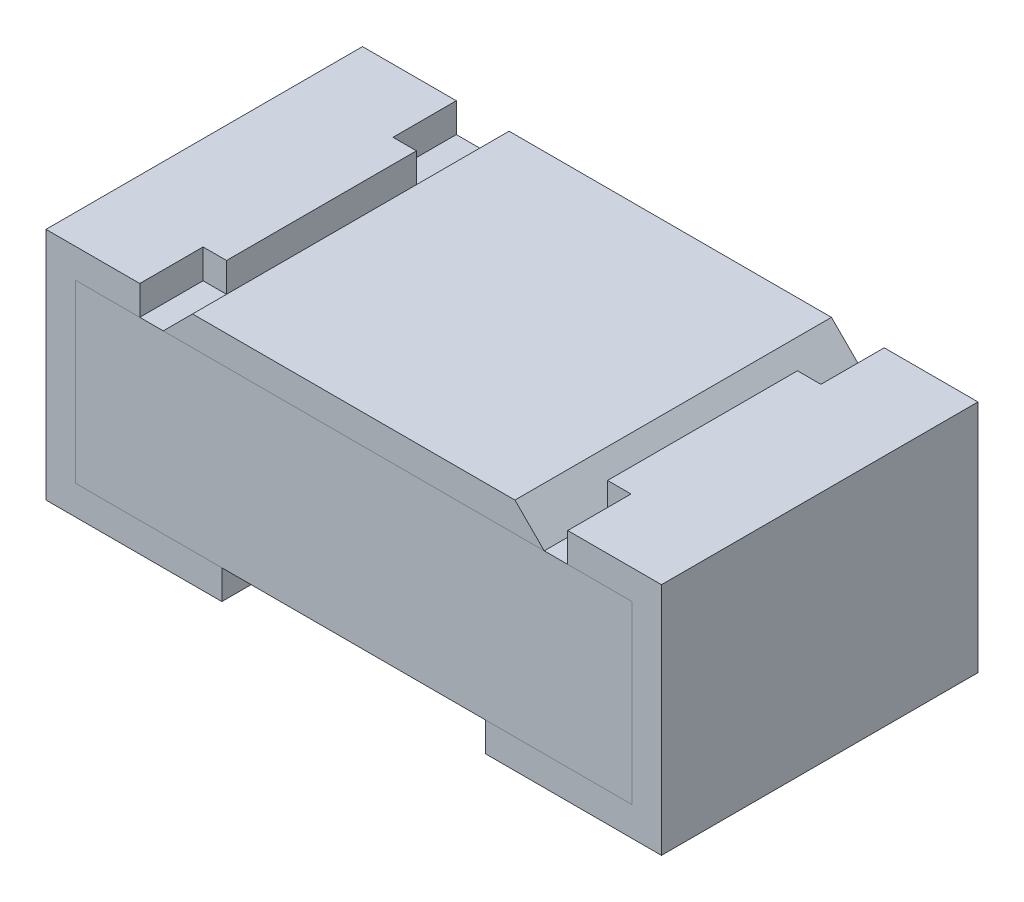
ISO-10303-21;
HEADER;
FILE_DESCRIPTION(('STEP AP214'),'2;1');
FILE_NAME('part.step','',(''),(''),'','','');
FILE_SCHEMA(('AUTOMOTIVE_DESIGN { 1 0 10303 214 1 1 1 1 }'));
ENDSEC;
DATA;
#1=APPLICATION_CONTEXT('core data for automotive mechanical design processes');
#2=APPLICATION_PROTOCOL_DEFINITION('international standard','automotive_design',2000,#1);
#3=PRODUCT_CONTEXT('',#1,'mechanical');
#4=PRODUCT('Part','Part','',(#3));
#5=PRODUCT_RELATED_PRODUCT_CATEGORY('part','',(#4));
#6=PRODUCT_DEFINITION_FORMATION('','',#4);
#7=PRODUCT_DEFINITION_CONTEXT('part definition',#1,'design');
#8=PRODUCT_DEFINITION('design','',#6,#7);
#9=PRODUCT_DEFINITION_SHAPE('','',#8);
#10=(LENGTH_UNIT() NAMED_UNIT(*) SI_UNIT(.MILLI.,.METRE.));
#11=(NAMED_UNIT(*) PLANE_ANGLE_UNIT() SI_UNIT($,.RADIAN.));
#12=(NAMED_UNIT(*) SI_UNIT($,.STERADIAN.) SOLID_ANGLE_UNIT());
#13=UNCERTAINTY_MEASURE_WITH_UNIT(LENGTH_MEASURE(1.E-05),#10,'distance_accuracy_value','');
#14=(GEOMETRIC_REPRESENTATION_CONTEXT(3) GLOBAL_UNCERTAINTY_ASSIGNED_CONTEXT((#13)) GLOBAL_UNIT_ASSIGNED_CONTEXT((#10,
#11,#12)) REPRESENTATION_CONTEXT('',''));
#15=CARTESIAN_POINT('',(0.,0.,0.));
#16=DIRECTION('',(0.,0.,1.));
#17=DIRECTION('',(1.,0.,0.));
#18=AXIS2_PLACEMENT_3D('',#15,#16,#17);
#19=CARTESIAN_POINT('',(0.225,0.,-0.77));
#20=DIRECTION('',(-1.,0.,0.));
#21=DIRECTION('',(0.,0.,1.));
#22=AXIS2_PLACEMENT_3D('',#19,#20,#21);
#23=PLANE('',#22);
#24=DIRECTION('',(0.,1.,0.));
#25=VECTOR('',#24,1.);
#26=CARTESIAN_POINT('',(0.225,0.,-0.27));
#27=LINE('',#26,#25);
#28=CARTESIAN_POINT('',(0.225,0.,-0.27));
#29=VERTEX_POINT('',#28);
#30=CARTESIAN_POINT('',(0.225,0.0500000000000001,-0.27));
#31=VERTEX_POINT('',#30);
#32=EDGE_CURVE('E60',#29,#31,#27,.T.);
#33=ORIENTED_EDGE('',*,*,#32,.F.);
#34=DIRECTION('',(0.,0.,1.));
#35=VECTOR('',#34,1.);
#36=CARTESIAN_POINT('',(0.225,0.,-0.77));
#37=LINE('',#36,#35);
#38=CARTESIAN_POINT('',(0.225,0.,0.27));
#39=VERTEX_POINT('',#38);
#40=EDGE_CURVE('E244',#29,#39,#37,.T.);
#41=ORIENTED_EDGE('',*,*,#40,.T.);
#42=DIRECTION('',(0.,-1.,0.));
#43=VECTOR('',#42,1.);
#44=CARTESIAN_POINT('',(0.225,0.,0.27));
#45=LINE('',#44,#43);
#46=CARTESIAN_POINT('',(0.225,0.0500000000000001,0.27));
#47=VERTEX_POINT('',#46);
#48=EDGE_CURVE('E174',#47,#39,#45,.T.);
#49=ORIENTED_EDGE('',*,*,#48,.F.);
#50=DIRECTION('',(0.,0.,1.));
#51=VECTOR('',#50,1.);
#52=CARTESIAN_POINT('',(0.225,0.0500000000000001,-0.77));
#53=LINE('',#52,#51);
#54=EDGE_CURVE('E204',#31,#47,#53,.T.);
#55=ORIENTED_EDGE('',*,*,#54,.F.);
#56=EDGE_LOOP('',(#33,#41,#49,#55));
#57=FACE_BOUND('',#56,.T.);
#58=ADVANCED_FACE('F52',(#57),#23,.T.);
#59=CARTESIAN_POINT('',(0.225,0.0500000000000001,-0.77));
#60=DIRECTION('',(0.,1.,0.));
#61=DIRECTION('',(-1.,0.,0.));
#62=AXIS2_PLACEMENT_3D('',#59,#60,#61);
#63=PLANE('',#62);
#64=DIRECTION('',(1.,0.,0.));
#65=VECTOR('',#64,1.);
#66=CARTESIAN_POINT('',(0.225,0.0500000000000001,-0.27));
#67=LINE('',#66,#65);
#68=CARTESIAN_POINT('',(0.475,0.0500000000000001,-0.27));
#69=VERTEX_POINT('',#68);
#70=EDGE_CURVE('E213',#31,#69,#67,.T.);
#71=ORIENTED_EDGE('',*,*,#70,.F.);
#72=ORIENTED_EDGE('',*,*,#54,.T.);
#73=DIRECTION('',(-1.,0.,0.));
#74=VECTOR('',#73,1.);
#75=CARTESIAN_POINT('',(0.225,0.0500000000000001,0.27));
#76=LINE('',#75,#74);
#77=CARTESIAN_POINT('',(0.475,0.0500000000000001,0.27));
#78=VERTEX_POINT('',#77);
#79=EDGE_CURVE('E240',#78,#47,#76,.T.);
#80=ORIENTED_EDGE('',*,*,#79,.F.);
#81=DIRECTION('',(0.,0.,1.));
#82=VECTOR('',#81,1.);
#83=CARTESIAN_POINT('',(0.475,0.0500000000000001,-0.77));
#84=LINE('',#83,#82);
#85=EDGE_CURVE('E247',#69,#78,#84,.T.);
#86=ORIENTED_EDGE('',*,*,#85,.F.);
#87=EDGE_LOOP('',(#71,#72,#80,#86));
#88=FACE_BOUND('',#87,.T.);
#89=ADVANCED_FACE('F283',(#88),#63,.T.);
#90=CARTESIAN_POINT('',(0.475,0.0500000000000001,-0.77));
#91=DIRECTION('',(-1.,0.,0.));
#92=DIRECTION('',(0.,-1.,0.));
#93=AXIS2_PLACEMENT_3D('',#90,#91,#92);
#94=PLANE('',#93);
#95=DIRECTION('',(0.,1.,0.));
#96=VECTOR('',#95,1.);
#97=CARTESIAN_POINT('',(0.475,0.0500000000000001,-0.27));
#98=LINE('',#97,#96);
#99=CARTESIAN_POINT('',(0.475,0.35,-0.27));
#100=VERTEX_POINT('',#99);
#101=EDGE_CURVE('E210',#69,#100,#98,.T.);
#102=ORIENTED_EDGE('',*,*,#101,.F.);
#103=ORIENTED_EDGE('',*,*,#85,.T.);
#104=DIRECTION('',(0.,-1.,0.));
#105=VECTOR('',#104,1.);
#106=CARTESIAN_POINT('',(0.475,0.0500000000000001,0.27));
#107=LINE('',#106,#105);
#108=CARTESIAN_POINT('',(0.475,0.35,0.27));
#109=VERTEX_POINT('',#108);
#110=EDGE_CURVE('E236',#109,#78,#107,.T.);
#111=ORIENTED_EDGE('',*,*,#110,.F.);
#112=DIRECTION('',(0.,0.,1.));
#113=VECTOR('',#112,1.);
#114=CARTESIAN_POINT('',(0.475,0.35,-0.77));
#115=LINE('',#114,#113);
#116=EDGE_CURVE('E250',#100,#109,#115,.T.);
#117=ORIENTED_EDGE('',*,*,#116,.F.);
#118=EDGE_LOOP('',(#102,#103,#111,#117));
#119=FACE_BOUND('',#118,.T.);
#120=ADVANCED_FACE('F289',(#119),#94,.T.);
#121=CARTESIAN_POINT('',(0.475,0.35,-0.77));
#122=DIRECTION('',(0.,-1.,0.));
#123=DIRECTION('',(1.,0.,0.));
#124=AXIS2_PLACEMENT_3D('',#121,#122,#123);
#125=PLANE('',#124);
#126=DIRECTION('',(0.,0.,-1.));
#127=VECTOR('',#126,1.);
#128=CARTESIAN_POINT('',(0.365,0.35,-0.27));
#129=LINE('',#128,#127);
#130=CARTESIAN_POINT('',(0.365,0.35,-0.162));
#131=VERTEX_POINT('',#130);
#132=CARTESIAN_POINT('',(0.365,0.35,-0.27));
#133=VERTEX_POINT('',#132);
#134=EDGE_CURVE('E139',#131,#133,#129,.T.);
#135=ORIENTED_EDGE('',*,*,#134,.T.);
#136=DIRECTION('',(-1.,0.,0.));
#137=VECTOR('',#136,1.);
#138=CARTESIAN_POINT('',(0.475,0.35,-0.27));
#139=LINE('',#138,#137);
#140=EDGE_CURVE('E207',#100,#133,#139,.T.);
#141=ORIENTED_EDGE('',*,*,#140,.F.);
#142=ORIENTED_EDGE('',*,*,#116,.T.);
#143=DIRECTION('',(1.,0.,0.));
#144=VECTOR('',#143,1.);
#145=CARTESIAN_POINT('',(0.475,0.35,0.27));
#146=LINE('',#145,#144);
#147=CARTESIAN_POINT('',(0.365,0.35,0.27));
#148=VERTEX_POINT('',#147);
#149=EDGE_CURVE('E233',#148,#109,#146,.T.);
#150=ORIENTED_EDGE('',*,*,#149,.F.);
#151=DIRECTION('',(0.,0.,-1.));
#152=VECTOR('',#151,1.);
#153=CARTESIAN_POINT('',(0.365,0.35,0.27));
#154=LINE('',#153,#152);
#155=CARTESIAN_POINT('',(0.365,0.35,0.162));
#156=VERTEX_POINT('',#155);
#157=EDGE_CURVE('E67',#148,#156,#154,.T.);
#158=ORIENTED_EDGE('',*,*,#157,.T.);
#159=DIRECTION('',(-1.,0.,0.));
#160=VECTOR('',#159,1.);
#161=CARTESIAN_POINT('',(0.325,0.35,0.162));
#162=LINE('',#161,#160);
#163=CARTESIAN_POINT('',(0.325,0.35,0.162));
#164=VERTEX_POINT('',#163);
#165=EDGE_CURVE('E189',#156,#164,#162,.T.);
#166=ORIENTED_EDGE('',*,*,#165,.T.);
#167=DIRECTION('',(0.,0.,1.));
#168=VECTOR('',#167,1.);
#169=CARTESIAN_POINT('',(0.325,0.35,-0.77));
#170=LINE('',#169,#168);
#171=CARTESIAN_POINT('',(0.325,0.35,-0.162));
#172=VERTEX_POINT('',#171);
#173=EDGE_CURVE('E164',#172,#164,#170,.T.);
#174=ORIENTED_EDGE('',*,*,#173,.F.);
#175=DIRECTION('',(1.,0.,0.));
#176=VECTOR('',#175,1.);
#177=CARTESIAN_POINT('',(0.325,0.35,-0.162));
#178=LINE('',#177,#176);
#179=EDGE_CURVE('E154',#172,#131,#178,.T.);
#180=ORIENTED_EDGE('',*,*,#179,.T.);
#181=EDGE_LOOP('',(#135,#141,#142,#150,#158,#166,#174,#180));
#182=FACE_BOUND('',#181,.T.);
#183=ADVANCED_FACE('F161',(#182),#125,.T.);
#184=CARTESIAN_POINT('',(0.325,0.4,-0.77));
#185=DIRECTION('',(-1.,0.,0.));
#186=DIRECTION('',(0.,-1.,0.));
#187=AXIS2_PLACEMENT_3D('',#184,#185,#186);
#188=PLANE('',#187);
#189=DIRECTION('',(0.,1.,0.));
#190=VECTOR('',#189,1.);
#191=CARTESIAN_POINT('',(0.325,-0.00100000000000002,-0.162));
#192=LINE('',#191,#190);
#193=CARTESIAN_POINT('',(0.325,0.4,-0.162));
#194=VERTEX_POINT('',#193);
#195=EDGE_CURVE('E150',#172,#194,#192,.T.);
#196=ORIENTED_EDGE('',*,*,#195,.F.);
#197=ORIENTED_EDGE('',*,*,#173,.T.);
#198=DIRECTION('',(0.,1.,0.));
#199=VECTOR('',#198,1.);
#200=CARTESIAN_POINT('',(0.325,-0.00100000000000002,0.162));
#201=LINE('',#200,#199);
#202=CARTESIAN_POINT('',(0.325,0.4,0.162));
#203=VERTEX_POINT('',#202);
#204=EDGE_CURVE('E182',#164,#203,#201,.T.);
#205=ORIENTED_EDGE('',*,*,#204,.T.);
#206=DIRECTION('',(0.,0.,1.));
#207=VECTOR('',#206,1.);
#208=CARTESIAN_POINT('',(0.325,0.4,-0.77));
#209=LINE('',#208,#207);
#210=EDGE_CURVE('E255',#194,#203,#209,.T.);
#211=ORIENTED_EDGE('',*,*,#210,.F.);
#212=EDGE_LOOP('',(#196,#197,#205,#211));
#213=FACE_BOUND('',#212,.T.);
#214=ADVANCED_FACE('F306',(#213),#188,.T.);
#215=CARTESIAN_POINT('',(0.525,0.4,-0.77));
#216=DIRECTION('',(0.,1.,0.));
#217=DIRECTION('',(-1.,0.,0.));
#218=AXIS2_PLACEMENT_3D('',#215,#216,#217);
#219=PLANE('',#218);
#220=DIRECTION('',(0.,0.,-1.));
#221=VECTOR('',#220,1.);
#222=CARTESIAN_POINT('',(0.365,0.4,-0.27));
#223=LINE('',#222,#221);
#224=CARTESIAN_POINT('',(0.365,0.4,-0.162));
#225=VERTEX_POINT('',#224);
#226=CARTESIAN_POINT('',(0.365,0.4,-0.27));
#227=VERTEX_POINT('',#226);
#228=EDGE_CURVE('E75',#225,#227,#223,.T.);
#229=ORIENTED_EDGE('',*,*,#228,.F.);
#230=DIRECTION('',(1.,0.,0.));
#231=VECTOR('',#230,1.);
#232=CARTESIAN_POINT('',(0.325,0.4,-0.162));
#233=LINE('',#232,#231);
#234=EDGE_CURVE('E157',#194,#225,#233,.T.);
#235=ORIENTED_EDGE('',*,*,#234,.F.);
#236=ORIENTED_EDGE('',*,*,#210,.T.);
#237=DIRECTION('',(-1.,0.,0.));
#238=VECTOR('',#237,1.);
#239=CARTESIAN_POINT('',(0.325,0.4,0.162));
#240=LINE('',#239,#238);
#241=CARTESIAN_POINT('',(0.365,0.4,0.162));
#242=VERTEX_POINT('',#241);
#243=EDGE_CURVE('E178',#242,#203,#240,.T.);
#244=ORIENTED_EDGE('',*,*,#243,.F.);
#245=DIRECTION('',(0.,0.,-1.));
#246=VECTOR('',#245,1.);
#247=CARTESIAN_POINT('',(0.365,0.4,0.27));
#248=LINE('',#247,#246);
#249=CARTESIAN_POINT('',(0.365,0.4,0.27));
#250=VERTEX_POINT('',#249);
#251=EDGE_CURVE('E185',#250,#242,#248,.T.);
#252=ORIENTED_EDGE('',*,*,#251,.F.);
#253=DIRECTION('',(-1.,0.,0.));
#254=VECTOR('',#253,1.);
#255=CARTESIAN_POINT('',(0.525,0.4,0.27));
#256=LINE('',#255,#254);
#257=CARTESIAN_POINT('',(0.525,0.4,0.27));
#258=VERTEX_POINT('',#257);
#259=EDGE_CURVE('E229',#258,#250,#256,.T.);
#260=ORIENTED_EDGE('',*,*,#259,.F.);
#261=DIRECTION('',(0.,0.,1.));
#262=VECTOR('',#261,1.);
#263=CARTESIAN_POINT('',(0.525,0.4,-0.77));
#264=LINE('',#263,#262);
#265=CARTESIAN_POINT('',(0.525,0.4,-0.27));
#266=VERTEX_POINT('',#265);
#267=EDGE_CURVE('E259',#266,#258,#264,.T.);
#268=ORIENTED_EDGE('',*,*,#267,.F.);
#269=DIRECTION('',(1.,0.,0.));
#270=VECTOR('',#269,1.);
#271=CARTESIAN_POINT('',(0.525,0.4,-0.27));
#272=LINE('',#271,#270);
#273=EDGE_CURVE('E203',#227,#266,#272,.T.);
#274=ORIENTED_EDGE('',*,*,#273,.F.);
#275=EDGE_LOOP('',(#229,#235,#236,#244,#252,#260,#268,#274));
#276=FACE_BOUND('',#275,.T.);
#277=ADVANCED_FACE('F295',(#276),#219,.T.);
#278=CARTESIAN_POINT('',(0.525,0.,-0.77));
#279=DIRECTION('',(1.,0.,0.));
#280=DIRECTION('',(0.,0.,-1.));
#281=AXIS2_PLACEMENT_3D('',#278,#279,#280);
#282=PLANE('',#281);
#283=DIRECTION('',(0.,-1.,0.));
#284=VECTOR('',#283,1.);
#285=CARTESIAN_POINT('',(0.525,0.,-0.27));
#286=LINE('',#285,#284);
#287=CARTESIAN_POINT('',(0.525,0.,-0.27));
#288=VERTEX_POINT('',#287);
#289=EDGE_CURVE('E200',#266,#288,#286,.T.);
#290=ORIENTED_EDGE('',*,*,#289,.F.);
#291=ORIENTED_EDGE('',*,*,#267,.T.);
#292=DIRECTION('',(0.,1.,0.));
#293=VECTOR('',#292,1.);
#294=CARTESIAN_POINT('',(0.525,0.,0.27));
#295=LINE('',#294,#293);
#296=CARTESIAN_POINT('',(0.525,0.,0.27));
#297=VERTEX_POINT('',#296);
#298=EDGE_CURVE('E225',#297,#258,#295,.T.);
#299=ORIENTED_EDGE('',*,*,#298,.F.);
#300=DIRECTION('',(0.,0.,1.));
#301=VECTOR('',#300,1.);
#302=CARTESIAN_POINT('',(0.525,0.,-0.77));
#303=LINE('',#302,#301);
#304=EDGE_CURVE('E262',#288,#297,#303,.T.);
#305=ORIENTED_EDGE('',*,*,#304,.F.);
#306=EDGE_LOOP('',(#290,#291,#299,#305));
#307=FACE_BOUND('',#306,.T.);
#308=ADVANCED_FACE('F299',(#307),#282,.T.);
#309=CARTESIAN_POINT('',(0.525,0.,-0.77));
#310=DIRECTION('',(0.,-1.,0.));
#311=DIRECTION('',(1.,0.,0.));
#312=AXIS2_PLACEMENT_3D('',#309,#310,#311);
#313=PLANE('',#312);
#314=DIRECTION('',(-1.,0.,0.));
#315=VECTOR('',#314,1.);
#316=CARTESIAN_POINT('',(0.525,0.,-0.27));
#317=LINE('',#316,#315);
#318=EDGE_CURVE('E12',#288,#29,#317,.T.);
#319=ORIENTED_EDGE('',*,*,#318,.F.);
#320=ORIENTED_EDGE('',*,*,#304,.T.);
#321=DIRECTION('',(1.,0.,0.));
#322=VECTOR('',#321,1.);
#323=CARTESIAN_POINT('',(0.525,0.,0.27));
#324=LINE('',#323,#322);
#325=EDGE_CURVE('E221',#39,#297,#324,.T.);
#326=ORIENTED_EDGE('',*,*,#325,.F.);
#327=ORIENTED_EDGE('',*,*,#40,.F.);
#328=EDGE_LOOP('',(#319,#320,#326,#327));
#329=FACE_BOUND('',#328,.T.);
#330=ADVANCED_FACE('F273',(#329),#313,.T.);
#331=CARTESIAN_POINT('',(0.,0.,0.27));
#332=DIRECTION('',(0.,0.,-1.));
#333=DIRECTION('',(-1.,0.,0.));
#334=AXIS2_PLACEMENT_3D('',#331,#332,#333);
#335=PLANE('',#334);
#336=ORIENTED_EDGE('',*,*,#259,.T.);
#337=DIRECTION('',(0.,1.,0.));
#338=VECTOR('',#337,1.);
#339=CARTESIAN_POINT('',(0.365,-0.00100000000000002,0.27));
#340=LINE('',#339,#338);
#341=EDGE_CURVE('E192',#148,#250,#340,.T.);
#342=ORIENTED_EDGE('',*,*,#341,.F.);
#343=ORIENTED_EDGE('',*,*,#149,.T.);
#344=ORIENTED_EDGE('',*,*,#110,.T.);
#345=ORIENTED_EDGE('',*,*,#79,.T.);
#346=ORIENTED_EDGE('',*,*,#48,.T.);
#347=ORIENTED_EDGE('',*,*,#325,.T.);
#348=ORIENTED_EDGE('',*,*,#298,.T.);
#349=EDGE_LOOP('',(#336,#342,#343,#344,#345,#346,#347,#348));
#350=FACE_BOUND('',#349,.T.);
#351=ADVANCED_FACE('F277',(#350),#335,.F.);
#352=CARTESIAN_POINT('',(-0.475,0.35,-0.27));
#353=DIRECTION('',(0.,0.,1.));
#354=DIRECTION('',(1.,0.,0.));
#355=AXIS2_PLACEMENT_3D('',#352,#353,#354);
#356=PLANE('',#355);
#357=ORIENTED_EDGE('',*,*,#140,.T.);
#358=DIRECTION('',(0.,1.,0.));
#359=VECTOR('',#358,1.);
#360=CARTESIAN_POINT('',(0.365,-0.00100000000000002,-0.27));
#361=LINE('',#360,#359);
#362=EDGE_CURVE('E144',#133,#227,#361,.T.);
#363=ORIENTED_EDGE('',*,*,#362,.T.);
#364=ORIENTED_EDGE('',*,*,#273,.T.);
#365=ORIENTED_EDGE('',*,*,#289,.T.);
#366=ORIENTED_EDGE('',*,*,#318,.T.);
#367=ORIENTED_EDGE('',*,*,#32,.T.);
#368=ORIENTED_EDGE('',*,*,#70,.T.);
#369=ORIENTED_EDGE('',*,*,#101,.T.);
#370=EDGE_LOOP('',(#357,#363,#364,#365,#366,#367,#368,#369));
#371=FACE_BOUND('',#370,.T.);
#372=ADVANCED_FACE('F286',(#371),#356,.F.);
#373=CARTESIAN_POINT('',(0.365,-0.00100000000000002,-0.27));
#374=DIRECTION('',(1.,0.,0.));
#375=DIRECTION('',(0.,0.,-1.));
#376=AXIS2_PLACEMENT_3D('',#373,#374,#375);
#377=PLANE('',#376);
#378=DIRECTION('',(0.,1.,0.));
#379=VECTOR('',#378,1.);
#380=CARTESIAN_POINT('',(0.365,-0.00100000000000002,-0.162));
#381=LINE('',#380,#379);
#382=EDGE_CURVE('E142',#131,#225,#381,.T.);
#383=ORIENTED_EDGE('',*,*,#382,.T.);
#384=ORIENTED_EDGE('',*,*,#228,.T.);
#385=ORIENTED_EDGE('',*,*,#362,.F.);
#386=ORIENTED_EDGE('',*,*,#134,.F.);
#387=EDGE_LOOP('',(#383,#384,#385,#386));
#388=FACE_BOUND('',#387,.T.);
#389=ADVANCED_FACE('F141',(#388),#377,.F.);
#390=CARTESIAN_POINT('',(0.325,-0.00100000000000002,-0.162));
#391=DIRECTION('',(0.,0.,1.));
#392=DIRECTION('',(1.,0.,0.));
#393=AXIS2_PLACEMENT_3D('',#390,#391,#392);
#394=PLANE('',#393);
#395=ORIENTED_EDGE('',*,*,#195,.T.);
#396=ORIENTED_EDGE('',*,*,#234,.T.);
#397=ORIENTED_EDGE('',*,*,#382,.F.);
#398=ORIENTED_EDGE('',*,*,#179,.F.);
#399=EDGE_LOOP('',(#395,#396,#397,#398));
#400=FACE_BOUND('',#399,.T.);
#401=ADVANCED_FACE('F153',(#400),#394,.F.);
#402=CARTESIAN_POINT('',(0.325,-0.00100000000000002,0.162));
#403=DIRECTION('',(0.,0.,-1.));
#404=DIRECTION('',(-1.,0.,0.));
#405=AXIS2_PLACEMENT_3D('',#402,#403,#404);
#406=PLANE('',#405);
#407=DIRECTION('',(0.,1.,0.));
#408=VECTOR('',#407,1.);
#409=CARTESIAN_POINT('',(0.365,-0.00100000000000002,0.162));
#410=LINE('',#409,#408);
#411=EDGE_CURVE('E181',#156,#242,#410,.T.);
#412=ORIENTED_EDGE('',*,*,#411,.T.);
#413=ORIENTED_EDGE('',*,*,#243,.T.);
#414=ORIENTED_EDGE('',*,*,#204,.F.);
#415=ORIENTED_EDGE('',*,*,#165,.F.);
#416=EDGE_LOOP('',(#412,#413,#414,#415));
#417=FACE_BOUND('',#416,.T.);
#418=ADVANCED_FACE('F304',(#417),#406,.F.);
#419=CARTESIAN_POINT('',(0.365,-0.00100000000000002,0.27));
#420=DIRECTION('',(1.,0.,0.));
#421=DIRECTION('',(0.,0.,-1.));
#422=AXIS2_PLACEMENT_3D('',#419,#420,#421);
#423=PLANE('',#422);
#424=ORIENTED_EDGE('',*,*,#341,.T.);
#425=ORIENTED_EDGE('',*,*,#251,.T.);
#426=ORIENTED_EDGE('',*,*,#411,.F.);
#427=ORIENTED_EDGE('',*,*,#157,.F.);
#428=EDGE_LOOP('',(#424,#425,#426,#427));
#429=FACE_BOUND('',#428,.T.);
#430=ADVANCED_FACE('F300',(#429),#423,.F.);
#431=CLOSED_SHELL('',(#58,#89,#120,#183,#214,#277,#308,#330,#351,#372,#389,#401,#418,#430));
#432=MANIFOLD_SOLID_BREP('B2',#431);
#433=CARTESIAN_POINT('',(-0.475,0.05,-0.77));
#434=DIRECTION('',(1.,0.,0.));
#435=DIRECTION('',(0.,0.,-1.));
#436=AXIS2_PLACEMENT_3D('',#433,#434,#435);
#437=PLANE('',#436);
#438=DIRECTION('',(0.,-1.,0.));
#439=VECTOR('',#438,1.);
#440=CARTESIAN_POINT('',(-0.475,0.05,-0.27));
#441=LINE('',#440,#439);
#442=CARTESIAN_POINT('',(-0.475,0.35,-0.27));
#443=VERTEX_POINT('',#442);
#444=CARTESIAN_POINT('',(-0.475,0.05,-0.27));
#445=VERTEX_POINT('',#444);
#446=EDGE_CURVE('E452',#443,#445,#441,.T.);
#447=ORIENTED_EDGE('',*,*,#446,.F.);
#448=DIRECTION('',(0.,0.,1.));
#449=VECTOR('',#448,1.);
#450=CARTESIAN_POINT('',(-0.475,0.35,-0.77));
#451=LINE('',#450,#449);
#452=CARTESIAN_POINT('',(-0.475,0.35,0.27));
#453=VERTEX_POINT('',#452);
#454=EDGE_CURVE('E560',#443,#453,#451,.T.);
#455=ORIENTED_EDGE('',*,*,#454,.T.);
#456=DIRECTION('',(0.,1.,0.));
#457=VECTOR('',#456,1.);
#458=CARTESIAN_POINT('',(-0.475,0.05,0.27));
#459=LINE('',#458,#457);
#460=CARTESIAN_POINT('',(-0.475,0.05,0.27));
#461=VERTEX_POINT('',#460);
#462=EDGE_CURVE('E543',#461,#453,#459,.T.);
#463=ORIENTED_EDGE('',*,*,#462,.F.);
#464=DIRECTION('',(0.,0.,1.));
#465=VECTOR('',#464,1.);
#466=CARTESIAN_POINT('',(-0.475,0.05,-0.77));
#467=LINE('',#466,#465);
#468=EDGE_CURVE('E582',#445,#461,#467,.T.);
#469=ORIENTED_EDGE('',*,*,#468,.F.);
#470=EDGE_LOOP('',(#447,#455,#463,#469));
#471=FACE_BOUND('',#470,.T.);
#472=ADVANCED_FACE('F444',(#471),#437,.T.);
#473=CARTESIAN_POINT('',(-0.225,0.05,-0.77));
#474=DIRECTION('',(0.,1.,0.));
#475=DIRECTION('',(-1.,0.,0.));
#476=AXIS2_PLACEMENT_3D('',#473,#474,#475);
#477=PLANE('',#476);
#478=DIRECTION('',(1.,0.,0.));
#479=VECTOR('',#478,1.);
#480=CARTESIAN_POINT('',(-0.225,0.05,-0.27));
#481=LINE('',#480,#479);
#482=CARTESIAN_POINT('',(-0.225,0.05,-0.27));
#483=VERTEX_POINT('',#482);
#484=EDGE_CURVE('E613',#445,#483,#481,.T.);
#485=ORIENTED_EDGE('',*,*,#484,.F.);
#486=ORIENTED_EDGE('',*,*,#468,.T.);
#487=DIRECTION('',(-1.,0.,0.));
#488=VECTOR('',#487,1.);
#489=CARTESIAN_POINT('',(-0.225,0.05,0.27));
#490=LINE('',#489,#488);
#491=CARTESIAN_POINT('',(-0.225,0.05,0.27));
#492=VERTEX_POINT('',#491);
#493=EDGE_CURVE('E568',#492,#461,#490,.T.);
#494=ORIENTED_EDGE('',*,*,#493,.F.);
#495=DIRECTION('',(0.,0.,1.));
#496=VECTOR('',#495,1.);
#497=CARTESIAN_POINT('',(-0.225,0.05,-0.77));
#498=LINE('',#497,#496);
#499=EDGE_CURVE('E579',#483,#492,#498,.T.);
#500=ORIENTED_EDGE('',*,*,#499,.F.);
#501=EDGE_LOOP('',(#485,#486,#494,#500));
#502=FACE_BOUND('',#501,.T.);
#503=ADVANCED_FACE('F697',(#502),#477,.T.);
#504=CARTESIAN_POINT('',(-0.225,0.,-0.77));
#505=DIRECTION('',(1.,0.,0.));
#506=DIRECTION('',(0.,0.,-1.));
#507=AXIS2_PLACEMENT_3D('',#504,#505,#506);
#508=PLANE('',#507);
#509=DIRECTION('',(0.,-1.,0.));
#510=VECTOR('',#509,1.);
#511=CARTESIAN_POINT('',(-0.225,0.,-0.27));
#512=LINE('',#511,#510);
#513=CARTESIAN_POINT('',(-0.225,0.,-0.27));
#514=VERTEX_POINT('',#513);
#515=EDGE_CURVE('E616',#483,#514,#512,.T.);
#516=ORIENTED_EDGE('',*,*,#515,.F.);
#517=ORIENTED_EDGE('',*,*,#499,.T.);
#518=DIRECTION('',(0.,1.,0.));
#519=VECTOR('',#518,1.);
#520=CARTESIAN_POINT('',(-0.225,0.,0.27));
#521=LINE('',#520,#519);
#522=CARTESIAN_POINT('',(-0.225,0.,0.27));
#523=VERTEX_POINT('',#522);
#524=EDGE_CURVE('E589',#523,#492,#521,.T.);
#525=ORIENTED_EDGE('',*,*,#524,.F.);
#526=DIRECTION('',(0.,0.,1.));
#527=VECTOR('',#526,1.);
#528=CARTESIAN_POINT('',(-0.225,0.,-0.77));
#529=LINE('',#528,#527);
#530=EDGE_CURVE('E576',#514,#523,#529,.T.);
#531=ORIENTED_EDGE('',*,*,#530,.F.);
#532=EDGE_LOOP('',(#516,#517,#525,#531));
#533=FACE_BOUND('',#532,.T.);
#534=ADVANCED_FACE('F694',(#533),#508,.T.);
#535=CARTESIAN_POINT('',(-0.525,0.,-0.77));
#536=DIRECTION('',(0.,-1.,0.));
#537=DIRECTION('',(0.,0.,-1.));
#538=AXIS2_PLACEMENT_3D('',#535,#536,#537);
#539=PLANE('',#538);
#540=DIRECTION('',(-1.,0.,0.));
#541=VECTOR('',#540,1.);
#542=CARTESIAN_POINT('',(-0.525,0.,-0.27));
#543=LINE('',#542,#541);
#544=CARTESIAN_POINT('',(-0.525,0.,-0.27));
#545=VERTEX_POINT('',#544);
#546=EDGE_CURVE('E619',#514,#545,#543,.T.);
#547=ORIENTED_EDGE('',*,*,#546,.F.);
#548=ORIENTED_EDGE('',*,*,#530,.T.);
#549=DIRECTION('',(1.,0.,0.));
#550=VECTOR('',#549,1.);
#551=CARTESIAN_POINT('',(-0.525,0.,0.27));
#552=LINE('',#551,#550);
#553=CARTESIAN_POINT('',(-0.525,0.,0.27));
#554=VERTEX_POINT('',#553);
#555=EDGE_CURVE('E593',#554,#523,#552,.T.);
#556=ORIENTED_EDGE('',*,*,#555,.F.);
#557=DIRECTION('',(0.,0.,1.));
#558=VECTOR('',#557,1.);
#559=CARTESIAN_POINT('',(-0.525,0.,-0.77));
#560=LINE('',#559,#558);
#561=EDGE_CURVE('E573',#545,#554,#560,.T.);
#562=ORIENTED_EDGE('',*,*,#561,.F.);
#563=EDGE_LOOP('',(#547,#548,#556,#562));
#564=FACE_BOUND('',#563,.T.);
#565=ADVANCED_FACE('F690',(#564),#539,.T.);
#566=CARTESIAN_POINT('',(-0.525,0.,-0.77));
#567=DIRECTION('',(-1.,0.,0.));
#568=DIRECTION('',(0.,0.,1.));
#569=AXIS2_PLACEMENT_3D('',#566,#567,#568);
#570=PLANE('',#569);
#571=DIRECTION('',(0.,1.,0.));
#572=VECTOR('',#571,1.);
#573=CARTESIAN_POINT('',(-0.525,0.,-0.27));
#574=LINE('',#573,#572);
#575=CARTESIAN_POINT('',(-0.525,0.4,-0.27));
#576=VERTEX_POINT('',#575);
#577=EDGE_CURVE('E621',#545,#576,#574,.T.);
#578=ORIENTED_EDGE('',*,*,#577,.F.);
#579=ORIENTED_EDGE('',*,*,#561,.T.);
#580=DIRECTION('',(0.,-1.,0.));
#581=VECTOR('',#580,1.);
#582=CARTESIAN_POINT('',(-0.525,0.,0.27));
#583=LINE('',#582,#581);
#584=CARTESIAN_POINT('',(-0.525,0.4,0.27));
#585=VERTEX_POINT('',#584);
#586=EDGE_CURVE('E597',#585,#554,#583,.T.);
#587=ORIENTED_EDGE('',*,*,#586,.F.);
#588=DIRECTION('',(0.,0.,1.));
#589=VECTOR('',#588,1.);
#590=CARTESIAN_POINT('',(-0.525,0.4,-0.77));
#591=LINE('',#590,#589);
#592=EDGE_CURVE('E565',#576,#585,#591,.T.);
#593=ORIENTED_EDGE('',*,*,#592,.F.);
#594=EDGE_LOOP('',(#578,#579,#587,#593));
#595=FACE_BOUND('',#594,.T.);
#596=ADVANCED_FACE('F684',(#595),#570,.T.);
#597=CARTESIAN_POINT('',(-0.525,0.4,-0.77));
#598=DIRECTION('',(0.,1.,0.));
#599=DIRECTION('',(0.,0.,1.));
#600=AXIS2_PLACEMENT_3D('',#597,#598,#599);
#601=PLANE('',#600);
#602=DIRECTION('',(0.,0.,1.));
#603=VECTOR('',#602,1.);
#604=CARTESIAN_POINT('',(-0.365,0.4,-0.27));
#605=LINE('',#604,#603);
#606=CARTESIAN_POINT('',(-0.365,0.4,-0.27));
#607=VERTEX_POINT('',#606);
#608=CARTESIAN_POINT('',(-0.365,0.4,-0.162));
#609=VERTEX_POINT('',#608);
#610=EDGE_CURVE('E553',#607,#609,#605,.T.);
#611=ORIENTED_EDGE('',*,*,#610,.F.);
#612=DIRECTION('',(1.,0.,0.));
#613=VECTOR('',#612,1.);
#614=CARTESIAN_POINT('',(-0.525,0.4,-0.27));
#615=LINE('',#614,#613);
#616=EDGE_CURVE('E585',#576,#607,#615,.T.);
#617=ORIENTED_EDGE('',*,*,#616,.F.);
#618=ORIENTED_EDGE('',*,*,#592,.T.);
#619=DIRECTION('',(-1.,0.,0.));
#620=VECTOR('',#619,1.);
#621=CARTESIAN_POINT('',(-0.525,0.4,0.27));
#622=LINE('',#621,#620);
#623=CARTESIAN_POINT('',(-0.365,0.4,0.27));
#624=VERTEX_POINT('',#623);
#625=EDGE_CURVE('E601',#624,#585,#622,.T.);
#626=ORIENTED_EDGE('',*,*,#625,.F.);
#627=DIRECTION('',(0.,0.,1.));
#628=VECTOR('',#627,1.);
#629=CARTESIAN_POINT('',(-0.365,0.4,0.27));
#630=LINE('',#629,#628);
#631=CARTESIAN_POINT('',(-0.365,0.4,0.162));
#632=VERTEX_POINT('',#631);
#633=EDGE_CURVE('E459',#632,#624,#630,.T.);
#634=ORIENTED_EDGE('',*,*,#633,.F.);
#635=DIRECTION('',(-1.,0.,0.));
#636=VECTOR('',#635,1.);
#637=CARTESIAN_POINT('',(-0.325,0.4,0.162));
#638=LINE('',#637,#636);
#639=CARTESIAN_POINT('',(-0.325,0.4,0.162));
#640=VERTEX_POINT('',#639);
#641=EDGE_CURVE('E639',#640,#632,#638,.T.);
#642=ORIENTED_EDGE('',*,*,#641,.F.);
#643=DIRECTION('',(0.,0.,1.));
#644=VECTOR('',#643,1.);
#645=CARTESIAN_POINT('',(-0.325,0.4,-0.77));
#646=LINE('',#645,#644);
#647=CARTESIAN_POINT('',(-0.325,0.4,-0.162));
#648=VERTEX_POINT('',#647);
#649=EDGE_CURVE('E559',#648,#640,#646,.T.);
#650=ORIENTED_EDGE('',*,*,#649,.F.);
#651=DIRECTION('',(1.,0.,0.));
#652=VECTOR('',#651,1.);
#653=CARTESIAN_POINT('',(-0.325,0.4,-0.162));
#654=LINE('',#653,#652);
#655=EDGE_CURVE('E537',#609,#648,#654,.T.);
#656=ORIENTED_EDGE('',*,*,#655,.F.);
#657=EDGE_LOOP('',(#611,#617,#618,#626,#634,#642,#650,#656));
#658=FACE_BOUND('',#657,.T.);
#659=ADVANCED_FACE('F662',(#658),#601,.T.);
#660=CARTESIAN_POINT('',(-0.325,0.4,-0.77));
#661=DIRECTION('',(1.,0.,0.));
#662=DIRECTION('',(0.,1.,0.));
#663=AXIS2_PLACEMENT_3D('',#660,#661,#662);
#664=PLANE('',#663);
#665=DIRECTION('',(0.,1.,0.));
#666=VECTOR('',#665,1.);
#667=CARTESIAN_POINT('',(-0.325,-0.00100000000000002,-0.162));
#668=LINE('',#667,#666);
#669=CARTESIAN_POINT('',(-0.325,0.35,-0.162));
#670=VERTEX_POINT('',#669);
#671=EDGE_CURVE('E532',#670,#648,#668,.T.);
#672=ORIENTED_EDGE('',*,*,#671,.T.);
#673=ORIENTED_EDGE('',*,*,#649,.T.);
#674=DIRECTION('',(0.,1.,0.));
#675=VECTOR('',#674,1.);
#676=CARTESIAN_POINT('',(-0.325,-0.00100000000000002,0.162));
#677=LINE('',#676,#675);
#678=CARTESIAN_POINT('',(-0.325,0.35,0.162));
#679=VERTEX_POINT('',#678);
#680=EDGE_CURVE('E557',#679,#640,#677,.T.);
#681=ORIENTED_EDGE('',*,*,#680,.F.);
#682=DIRECTION('',(0.,0.,1.));
#683=VECTOR('',#682,1.);
#684=CARTESIAN_POINT('',(-0.325,0.35,-0.77));
#685=LINE('',#684,#683);
#686=EDGE_CURVE('E550',#670,#679,#685,.T.);
#687=ORIENTED_EDGE('',*,*,#686,.F.);
#688=EDGE_LOOP('',(#672,#673,#681,#687));
#689=FACE_BOUND('',#688,.T.);
#690=ADVANCED_FACE('F556',(#689),#664,.T.);
#691=CARTESIAN_POINT('',(-0.475,0.35,-0.77));
#692=DIRECTION('',(0.,-1.,0.));
#693=DIRECTION('',(0.,0.,-1.));
#694=AXIS2_PLACEMENT_3D('',#691,#692,#693);
#695=PLANE('',#694);
#696=DIRECTION('',(0.,0.,1.));
#697=VECTOR('',#696,1.);
#698=CARTESIAN_POINT('',(-0.365,0.35,-0.27));
#699=LINE('',#698,#697);
#700=CARTESIAN_POINT('',(-0.365,0.35,-0.27));
#701=VERTEX_POINT('',#700);
#702=CARTESIAN_POINT('',(-0.365,0.35,-0.162));
#703=VERTEX_POINT('',#702);
#704=EDGE_CURVE('E467',#701,#703,#699,.T.);
#705=ORIENTED_EDGE('',*,*,#704,.T.);
#706=DIRECTION('',(1.,0.,0.));
#707=VECTOR('',#706,1.);
#708=CARTESIAN_POINT('',(-0.325,0.35,-0.162));
#709=LINE('',#708,#707);
#710=EDGE_CURVE('E535',#703,#670,#709,.T.);
#711=ORIENTED_EDGE('',*,*,#710,.T.);
#712=ORIENTED_EDGE('',*,*,#686,.T.);
#713=DIRECTION('',(-1.,0.,0.));
#714=VECTOR('',#713,1.);
#715=CARTESIAN_POINT('',(-0.325,0.35,0.162));
#716=LINE('',#715,#714);
#717=CARTESIAN_POINT('',(-0.365,0.35,0.162));
#718=VERTEX_POINT('',#717);
#719=EDGE_CURVE('E627',#679,#718,#716,.T.);
#720=ORIENTED_EDGE('',*,*,#719,.T.);
#721=DIRECTION('',(0.,0.,1.));
#722=VECTOR('',#721,1.);
#723=CARTESIAN_POINT('',(-0.365,0.35,0.27));
#724=LINE('',#723,#722);
#725=CARTESIAN_POINT('',(-0.365,0.35,0.27));
#726=VERTEX_POINT('',#725);
#727=EDGE_CURVE('E643',#718,#726,#724,.T.);
#728=ORIENTED_EDGE('',*,*,#727,.T.);
#729=DIRECTION('',(1.,0.,0.));
#730=VECTOR('',#729,1.);
#731=CARTESIAN_POINT('',(-0.475,0.35,0.27));
#732=LINE('',#731,#730);
#733=EDGE_CURVE('E604',#453,#726,#732,.T.);
#734=ORIENTED_EDGE('',*,*,#733,.F.);
#735=ORIENTED_EDGE('',*,*,#454,.F.);
#736=DIRECTION('',(-1.,0.,0.));
#737=VECTOR('',#736,1.);
#738=CARTESIAN_POINT('',(-0.475,0.35,-0.27));
#739=LINE('',#738,#737);
#740=EDGE_CURVE('E50',#701,#443,#739,.T.);
#741=ORIENTED_EDGE('',*,*,#740,.F.);
#742=EDGE_LOOP('',(#705,#711,#712,#720,#728,#734,#735,#741));
#743=FACE_BOUND('',#742,.T.);
#744=ADVANCED_FACE('F548',(#743),#695,.T.);
#745=CARTESIAN_POINT('',(0.,0.,0.27));
#746=DIRECTION('',(0.,0.,-1.));
#747=DIRECTION('',(-1.,0.,0.));
#748=AXIS2_PLACEMENT_3D('',#745,#746,#747);
#749=PLANE('',#748);
#750=ORIENTED_EDGE('',*,*,#733,.T.);
#751=DIRECTION('',(0.,1.,0.));
#752=VECTOR('',#751,1.);
#753=CARTESIAN_POINT('',(-0.365,-0.00100000000000002,0.27));
#754=LINE('',#753,#752);
#755=EDGE_CURVE('E630',#726,#624,#754,.T.);
#756=ORIENTED_EDGE('',*,*,#755,.T.);
#757=ORIENTED_EDGE('',*,*,#625,.T.);
#758=ORIENTED_EDGE('',*,*,#586,.T.);
#759=ORIENTED_EDGE('',*,*,#555,.T.);
#760=ORIENTED_EDGE('',*,*,#524,.T.);
#761=ORIENTED_EDGE('',*,*,#493,.T.);
#762=ORIENTED_EDGE('',*,*,#462,.T.);
#763=EDGE_LOOP('',(#750,#756,#757,#758,#759,#760,#761,#762));
#764=FACE_BOUND('',#763,.T.);
#765=ADVANCED_FACE('F671',(#764),#749,.F.);
#766=CARTESIAN_POINT('',(-0.475,0.35,-0.27));
#767=DIRECTION('',(0.,0.,1.));
#768=DIRECTION('',(1.,0.,0.));
#769=AXIS2_PLACEMENT_3D('',#766,#767,#768);
#770=PLANE('',#769);
#771=ORIENTED_EDGE('',*,*,#616,.T.);
#772=DIRECTION('',(0.,1.,0.));
#773=VECTOR('',#772,1.);
#774=CARTESIAN_POINT('',(-0.365,-0.00100000000000002,-0.27));
#775=LINE('',#774,#773);
#776=EDGE_CURVE('E647',#701,#607,#775,.T.);
#777=ORIENTED_EDGE('',*,*,#776,.F.);
#778=ORIENTED_EDGE('',*,*,#740,.T.);
#779=ORIENTED_EDGE('',*,*,#446,.T.);
#780=ORIENTED_EDGE('',*,*,#484,.T.);
#781=ORIENTED_EDGE('',*,*,#515,.T.);
#782=ORIENTED_EDGE('',*,*,#546,.T.);
#783=ORIENTED_EDGE('',*,*,#577,.T.);
#784=EDGE_LOOP('',(#771,#777,#778,#779,#780,#781,#782,#783));
#785=FACE_BOUND('',#784,.T.);
#786=ADVANCED_FACE('F678',(#785),#770,.F.);
#787=CARTESIAN_POINT('',(-0.365,-0.00100000000000002,-0.27));
#788=DIRECTION('',(-1.,0.,0.));
#789=DIRECTION('',(0.,0.,1.));
#790=AXIS2_PLACEMENT_3D('',#787,#788,#789);
#791=PLANE('',#790);
#792=ORIENTED_EDGE('',*,*,#776,.T.);
#793=ORIENTED_EDGE('',*,*,#610,.T.);
#794=DIRECTION('',(0.,1.,0.));
#795=VECTOR('',#794,1.);
#796=CARTESIAN_POINT('',(-0.365,-0.00100000000000002,-0.162));
#797=LINE('',#796,#795);
#798=EDGE_CURVE('E544',#703,#609,#797,.T.);
#799=ORIENTED_EDGE('',*,*,#798,.F.);
#800=ORIENTED_EDGE('',*,*,#704,.F.);
#801=EDGE_LOOP('',(#792,#793,#799,#800));
#802=FACE_BOUND('',#801,.T.);
#803=ADVANCED_FACE('F659',(#802),#791,.F.);
#804=CARTESIAN_POINT('',(-0.325,-0.00100000000000002,-0.162));
#805=DIRECTION('',(0.,0.,1.));
#806=DIRECTION('',(1.,0.,0.));
#807=AXIS2_PLACEMENT_3D('',#804,#805,#806);
#808=PLANE('',#807);
#809=ORIENTED_EDGE('',*,*,#798,.T.);
#810=ORIENTED_EDGE('',*,*,#655,.T.);
#811=ORIENTED_EDGE('',*,*,#671,.F.);
#812=ORIENTED_EDGE('',*,*,#710,.F.);
#813=EDGE_LOOP('',(#809,#810,#811,#812));
#814=FACE_BOUND('',#813,.T.);
#815=ADVANCED_FACE('F534',(#814),#808,.F.);
#816=CARTESIAN_POINT('',(-0.325,-0.00100000000000002,0.162));
#817=DIRECTION('',(0.,0.,-1.));
#818=DIRECTION('',(-1.,0.,0.));
#819=AXIS2_PLACEMENT_3D('',#816,#817,#818);
#820=PLANE('',#819);
#821=ORIENTED_EDGE('',*,*,#680,.T.);
#822=ORIENTED_EDGE('',*,*,#641,.T.);
#823=DIRECTION('',(0.,1.,0.));
#824=VECTOR('',#823,1.);
#825=CARTESIAN_POINT('',(-0.365,-0.00100000000000002,0.162));
#826=LINE('',#825,#824);
#827=EDGE_CURVE('E633',#718,#632,#826,.T.);
#828=ORIENTED_EDGE('',*,*,#827,.F.);
#829=ORIENTED_EDGE('',*,*,#719,.F.);
#830=EDGE_LOOP('',(#821,#822,#828,#829));
#831=FACE_BOUND('',#830,.T.);
#832=ADVANCED_FACE('F667',(#831),#820,.F.);
#833=CARTESIAN_POINT('',(-0.365,-0.00100000000000002,0.27));
#834=DIRECTION('',(-1.,0.,0.));
#835=DIRECTION('',(0.,0.,1.));
#836=AXIS2_PLACEMENT_3D('',#833,#834,#835);
#837=PLANE('',#836);
#838=ORIENTED_EDGE('',*,*,#827,.T.);
#839=ORIENTED_EDGE('',*,*,#633,.T.);
#840=ORIENTED_EDGE('',*,*,#755,.F.);
#841=ORIENTED_EDGE('',*,*,#727,.F.);
#842=EDGE_LOOP('',(#838,#839,#840,#841));
#843=FACE_BOUND('',#842,.T.);
#844=ADVANCED_FACE('F729',(#843),#837,.F.);
#845=CLOSED_SHELL('',(#472,#503,#534,#565,#596,#659,#690,#744,#765,#786,#803,#815,#832,#844));
#846=MANIFOLD_SOLID_BREP('B6',#845);
#847=CARTESIAN_POINT('',(0.325,0.4,0.27));
#848=DIRECTION('',(0.,0.,-1.));
#849=DIRECTION('',(-1.,0.,0.));
#850=AXIS2_PLACEMENT_3D('',#847,#848,#849);
#851=PLANE('',#850);
#852=DIRECTION('',(1.,0.,0.));
#853=VECTOR('',#852,1.);
#854=CARTESIAN_POINT('',(0.325,0.4,0.27));
#855=LINE('',#854,#853);
#856=CARTESIAN_POINT('',(-0.275,0.4,0.27));
#857=VERTEX_POINT('',#856);
#858=CARTESIAN_POINT('',(0.275,0.4,0.27));
#859=VERTEX_POINT('',#858);
#860=EDGE_CURVE('E880',#857,#859,#855,.T.);
#861=ORIENTED_EDGE('',*,*,#860,.F.);
#862=DIRECTION('',(-0.707106781186546,-0.707106781186549,0.));
#863=VECTOR('',#862,1.);
#864=CARTESIAN_POINT('',(-0.275,0.4,0.27));
#865=LINE('',#864,#863);
#866=CARTESIAN_POINT('',(-0.325,0.35,0.27));
#867=VERTEX_POINT('',#866);
#868=EDGE_CURVE('E875',#857,#867,#865,.T.);
#869=ORIENTED_EDGE('',*,*,#868,.T.);
#870=DIRECTION('',(1.,0.,0.));
#871=VECTOR('',#870,1.);
#872=CARTESIAN_POINT('',(0.325,0.35,0.27));
#873=LINE('',#872,#871);
#874=CARTESIAN_POINT('',(0.325,0.35,0.27));
#875=VERTEX_POINT('',#874);
#876=EDGE_CURVE('E877',#867,#875,#873,.T.);
#877=ORIENTED_EDGE('',*,*,#876,.T.);
#878=DIRECTION('',(-0.707106781186546,0.707106781186549,0.));
#879=VECTOR('',#878,1.);
#880=CARTESIAN_POINT('',(0.275,0.4,0.27));
#881=LINE('',#880,#879);
#882=EDGE_CURVE('E886',#875,#859,#881,.T.);
#883=ORIENTED_EDGE('',*,*,#882,.T.);
#884=EDGE_LOOP('',(#861,#869,#877,#883));
#885=FACE_BOUND('',#884,.T.);
#886=ADVANCED_FACE('F835',(#885),#851,.F.);
#887=CARTESIAN_POINT('',(0.325,0.4,-0.27));
#888=DIRECTION('',(0.,0.,1.));
#889=DIRECTION('',(1.,0.,0.));
#890=AXIS2_PLACEMENT_3D('',#887,#888,#889);
#891=PLANE('',#890);
#892=DIRECTION('',(-1.,0.,0.));
#893=VECTOR('',#892,1.);
#894=CARTESIAN_POINT('',(0.325,0.35,-0.27));
#895=LINE('',#894,#893);
#896=CARTESIAN_POINT('',(0.325,0.35,-0.27));
#897=VERTEX_POINT('',#896);
#898=CARTESIAN_POINT('',(-0.325,0.35,-0.27));
#899=VERTEX_POINT('',#898);
#900=EDGE_CURVE('E907',#897,#899,#895,.T.);
#901=ORIENTED_EDGE('',*,*,#900,.T.);
#902=DIRECTION('',(0.707106781186546,0.707106781186549,0.));
#903=VECTOR('',#902,1.);
#904=CARTESIAN_POINT('',(-0.275,0.4,-0.27));
#905=LINE('',#904,#903);
#906=CARTESIAN_POINT('',(-0.275,0.4,-0.27));
#907=VERTEX_POINT('',#906);
#908=EDGE_CURVE('E442',#899,#907,#905,.T.);
#909=ORIENTED_EDGE('',*,*,#908,.T.);
#910=DIRECTION('',(-1.,0.,0.));
#911=VECTOR('',#910,1.);
#912=CARTESIAN_POINT('',(0.325,0.4,-0.27));
#913=LINE('',#912,#911);
#914=CARTESIAN_POINT('',(0.275,0.4,-0.27));
#915=VERTEX_POINT('',#914);
#916=EDGE_CURVE('E903',#915,#907,#913,.T.);
#917=ORIENTED_EDGE('',*,*,#916,.F.);
#918=DIRECTION('',(0.707106781186546,-0.707106781186549,0.));
#919=VECTOR('',#918,1.);
#920=CARTESIAN_POINT('',(0.275,0.4,-0.27));
#921=LINE('',#920,#919);
#922=EDGE_CURVE('E844',#915,#897,#921,.T.);
#923=ORIENTED_EDGE('',*,*,#922,.T.);
#924=EDGE_LOOP('',(#901,#909,#917,#923));
#925=FACE_BOUND('',#924,.T.);
#926=ADVANCED_FACE('F918',(#925),#891,.F.);
#927=CARTESIAN_POINT('',(0.,0.4,0.));
#928=DIRECTION('',(0.,1.,0.));
#929=DIRECTION('',(0.,0.,1.));
#930=AXIS2_PLACEMENT_3D('',#927,#928,#929);
#931=PLANE('',#930);
#932=ORIENTED_EDGE('',*,*,#916,.T.);
#933=DIRECTION('',(0.,0.,1.));
#934=VECTOR('',#933,1.);
#935=CARTESIAN_POINT('',(-0.275,0.4,0.27));
#936=LINE('',#935,#934);
#937=EDGE_CURVE('E912',#907,#857,#936,.T.);
#938=ORIENTED_EDGE('',*,*,#937,.T.);
#939=ORIENTED_EDGE('',*,*,#860,.T.);
#940=DIRECTION('',(0.,0.,-1.));
#941=VECTOR('',#940,1.);
#942=CARTESIAN_POINT('',(0.275,0.4,-0.27));
#943=LINE('',#942,#941);
#944=EDGE_CURVE('E910',#859,#915,#943,.T.);
#945=ORIENTED_EDGE('',*,*,#944,.T.);
#946=EDGE_LOOP('',(#932,#938,#939,#945));
#947=FACE_BOUND('',#946,.T.);
#948=ADVANCED_FACE('F920',(#947),#931,.T.);
#949=CARTESIAN_POINT('',(0.,0.35,0.));
#950=DIRECTION('',(0.,1.,0.));
#951=DIRECTION('',(0.,0.,1.));
#952=AXIS2_PLACEMENT_3D('',#949,#950,#951);
#953=PLANE('',#952);
#954=DIRECTION('',(0.,0.,1.));
#955=VECTOR('',#954,1.);
#956=CARTESIAN_POINT('',(-0.325,0.35,0.27));
#957=LINE('',#956,#955);
#958=EDGE_CURVE('E892',#899,#867,#957,.T.);
#959=ORIENTED_EDGE('',*,*,#958,.F.);
#960=ORIENTED_EDGE('',*,*,#900,.F.);
#961=DIRECTION('',(0.,0.,-1.));
#962=VECTOR('',#961,1.);
#963=CARTESIAN_POINT('',(0.325,0.35,0.27));
#964=LINE('',#963,#962);
#965=EDGE_CURVE('E893',#875,#897,#964,.T.);
#966=ORIENTED_EDGE('',*,*,#965,.F.);
#967=ORIENTED_EDGE('',*,*,#876,.F.);
#968=EDGE_LOOP('',(#959,#960,#966,#967));
#969=FACE_BOUND('',#968,.T.);
#970=ADVANCED_FACE('F890',(#969),#953,.F.);
#971=CARTESIAN_POINT('',(-0.275,0.4,0.));
#972=DIRECTION('',(-0.707106781186549,0.707106781186546,0.));
#973=DIRECTION('',(0.,0.,-1.));
#974=AXIS2_PLACEMENT_3D('',#971,#972,#973);
#975=PLANE('',#974);
#976=ORIENTED_EDGE('',*,*,#908,.F.);
#977=ORIENTED_EDGE('',*,*,#958,.T.);
#978=ORIENTED_EDGE('',*,*,#868,.F.);
#979=ORIENTED_EDGE('',*,*,#937,.F.);
#980=EDGE_LOOP('',(#976,#977,#978,#979));
#981=FACE_BOUND('',#980,.T.);
#982=ADVANCED_FACE('F897',(#981),#975,.T.);
#983=CARTESIAN_POINT('',(0.275,0.4,0.));
#984=DIRECTION('',(0.707106781186549,0.707106781186546,0.));
#985=DIRECTION('',(0.,0.,1.));
#986=AXIS2_PLACEMENT_3D('',#983,#984,#985);
#987=PLANE('',#986);
#988=ORIENTED_EDGE('',*,*,#882,.F.);
#989=ORIENTED_EDGE('',*,*,#965,.T.);
#990=ORIENTED_EDGE('',*,*,#922,.F.);
#991=ORIENTED_EDGE('',*,*,#944,.F.);
#992=EDGE_LOOP('',(#988,#989,#990,#991));
#993=FACE_BOUND('',#992,.T.);
#994=ADVANCED_FACE('F837',(#993),#987,.T.);
#995=CLOSED_SHELL('',(#886,#926,#948,#970,#982,#994));
#996=MANIFOLD_SOLID_BREP('B44',#995);
#997=CARTESIAN_POINT('',(0.475,0.35,0.27));
#998=DIRECTION('',(-1.,0.,0.));
#999=DIRECTION('',(0.,0.,1.));
#1000=AXIS2_PLACEMENT_3D('',#997,#998,#999);
#1001=PLANE('',#1000);
#1002=DIRECTION('',(0.,0.,-1.));
#1003=VECTOR('',#1002,1.);
#1004=CARTESIAN_POINT('',(0.475,0.05,0.27));
#1005=LINE('',#1004,#1003);
#1006=CARTESIAN_POINT('',(0.475,0.05,0.27));
#1007=VERTEX_POINT('',#1006);
#1008=CARTESIAN_POINT('',(0.475,0.05,-0.27));
#1009=VERTEX_POINT('',#1008);
#1010=EDGE_CURVE('E1046',#1007,#1009,#1005,.T.);
#1011=ORIENTED_EDGE('',*,*,#1010,.T.);
#1012=DIRECTION('',(0.,-1.,0.));
#1013=VECTOR('',#1012,1.);
#1014=CARTESIAN_POINT('',(0.475,0.35,-0.27));
#1015=LINE('',#1014,#1013);
#1016=CARTESIAN_POINT('',(0.475,0.35,-0.27));
#1017=VERTEX_POINT('',#1016);
#1018=EDGE_CURVE('E833',#1017,#1009,#1015,.T.);
#1019=ORIENTED_EDGE('',*,*,#1018,.F.);
#1020=DIRECTION('',(0.,0.,-1.));
#1021=VECTOR('',#1020,1.);
#1022=CARTESIAN_POINT('',(0.475,0.35,0.27));
#1023=LINE('',#1022,#1021);
#1024=CARTESIAN_POINT('',(0.475,0.35,0.27));
#1025=VERTEX_POINT('',#1024);
#1026=EDGE_CURVE('E1029',#1025,#1017,#1023,.T.);
#1027=ORIENTED_EDGE('',*,*,#1026,.F.);
#1028=DIRECTION('',(0.,-1.,0.));
#1029=VECTOR('',#1028,1.);
#1030=CARTESIAN_POINT('',(0.475,0.35,0.27));
#1031=LINE('',#1030,#1029);
#1032=EDGE_CURVE('E1042',#1025,#1007,#1031,.T.);
#1033=ORIENTED_EDGE('',*,*,#1032,.T.);
#1034=EDGE_LOOP('',(#1011,#1019,#1027,#1033));
#1035=FACE_BOUND('',#1034,.T.);
#1036=ADVANCED_FACE('F977',(#1035),#1001,.F.);
#1037=CARTESIAN_POINT('',(-0.475,0.35,-0.27));
#1038=DIRECTION('',(0.,0.,1.));
#1039=DIRECTION('',(1.,0.,0.));
#1040=AXIS2_PLACEMENT_3D('',#1037,#1038,#1039);
#1041=PLANE('',#1040);
#1042=DIRECTION('',(-1.,0.,0.));
#1043=VECTOR('',#1042,1.);
#1044=CARTESIAN_POINT('',(-0.475,0.05,-0.27));
#1045=LINE('',#1044,#1043);
#1046=CARTESIAN_POINT('',(-0.475,0.05,-0.27));
#1047=VERTEX_POINT('',#1046);
#1048=EDGE_CURVE('E1034',#1009,#1047,#1045,.T.);
#1049=ORIENTED_EDGE('',*,*,#1048,.T.);
#1050=DIRECTION('',(0.,-1.,0.));
#1051=VECTOR('',#1050,1.);
#1052=CARTESIAN_POINT('',(-0.475,0.35,-0.27));
#1053=LINE('',#1052,#1051);
#1054=CARTESIAN_POINT('',(-0.475,0.35,-0.27));
#1055=VERTEX_POINT('',#1054);
#1056=EDGE_CURVE('E986',#1055,#1047,#1053,.T.);
#1057=ORIENTED_EDGE('',*,*,#1056,.F.);
#1058=DIRECTION('',(-1.,0.,0.));
#1059=VECTOR('',#1058,1.);
#1060=CARTESIAN_POINT('',(-0.475,0.35,-0.27));
#1061=LINE('',#1060,#1059);
#1062=EDGE_CURVE('E1024',#1017,#1055,#1061,.T.);
#1063=ORIENTED_EDGE('',*,*,#1062,.F.);
#1064=ORIENTED_EDGE('',*,*,#1018,.T.);
#1065=EDGE_LOOP('',(#1049,#1057,#1063,#1064));
#1066=FACE_BOUND('',#1065,.T.);
#1067=ADVANCED_FACE('F1033',(#1066),#1041,.F.);
#1068=CARTESIAN_POINT('',(-0.475,0.35,0.27));
#1069=DIRECTION('',(1.,0.,0.));
#1070=DIRECTION('',(0.,0.,-1.));
#1071=AXIS2_PLACEMENT_3D('',#1068,#1069,#1070);
#1072=PLANE('',#1071);
#1073=DIRECTION('',(0.,0.,1.));
#1074=VECTOR('',#1073,1.);
#1075=CARTESIAN_POINT('',(-0.475,0.05,0.27));
#1076=LINE('',#1075,#1074);
#1077=CARTESIAN_POINT('',(-0.475,0.05,0.27));
#1078=VERTEX_POINT('',#1077);
#1079=EDGE_CURVE('E1011',#1047,#1078,#1076,.T.);
#1080=ORIENTED_EDGE('',*,*,#1079,.T.);
#1081=DIRECTION('',(0.,-1.,0.));
#1082=VECTOR('',#1081,1.);
#1083=CARTESIAN_POINT('',(-0.475,0.35,0.27));
#1084=LINE('',#1083,#1082);
#1085=CARTESIAN_POINT('',(-0.475,0.35,0.27));
#1086=VERTEX_POINT('',#1085);
#1087=EDGE_CURVE('E1036',#1086,#1078,#1084,.T.);
#1088=ORIENTED_EDGE('',*,*,#1087,.F.);
#1089=DIRECTION('',(0.,0.,1.));
#1090=VECTOR('',#1089,1.);
#1091=CARTESIAN_POINT('',(-0.475,0.35,0.27));
#1092=LINE('',#1091,#1090);
#1093=EDGE_CURVE('E1027',#1055,#1086,#1092,.T.);
#1094=ORIENTED_EDGE('',*,*,#1093,.F.);
#1095=ORIENTED_EDGE('',*,*,#1056,.T.);
#1096=EDGE_LOOP('',(#1080,#1088,#1094,#1095));
#1097=FACE_BOUND('',#1096,.T.);
#1098=ADVANCED_FACE('F1037',(#1097),#1072,.F.);
#1099=CARTESIAN_POINT('',(-0.475,0.35,0.27));
#1100=DIRECTION('',(0.,0.,-1.));
#1101=DIRECTION('',(-1.,0.,0.));
#1102=AXIS2_PLACEMENT_3D('',#1099,#1100,#1101);
#1103=PLANE('',#1102);
#1104=DIRECTION('',(1.,0.,0.));
#1105=VECTOR('',#1104,1.);
#1106=CARTESIAN_POINT('',(-0.475,0.05,0.27));
#1107=LINE('',#1106,#1105);
#1108=EDGE_CURVE('E1017',#1078,#1007,#1107,.T.);
#1109=ORIENTED_EDGE('',*,*,#1108,.T.);
#1110=ORIENTED_EDGE('',*,*,#1032,.F.);
#1111=DIRECTION('',(1.,0.,0.));
#1112=VECTOR('',#1111,1.);
#1113=CARTESIAN_POINT('',(-0.475,0.35,0.27));
#1114=LINE('',#1113,#1112);
#1115=EDGE_CURVE('E994',#1086,#1025,#1114,.T.);
#1116=ORIENTED_EDGE('',*,*,#1115,.F.);
#1117=ORIENTED_EDGE('',*,*,#1087,.T.);
#1118=EDGE_LOOP('',(#1109,#1110,#1116,#1117));
#1119=FACE_BOUND('',#1118,.T.);
#1120=ADVANCED_FACE('F1058',(#1119),#1103,.F.);
#1121=CARTESIAN_POINT('',(0.,0.35,0.));
#1122=DIRECTION('',(0.,-1.,0.));
#1123=DIRECTION('',(0.,0.,-1.));
#1124=AXIS2_PLACEMENT_3D('',#1121,#1122,#1123);
#1125=PLANE('',#1124);
#1126=ORIENTED_EDGE('',*,*,#1026,.T.);
#1127=ORIENTED_EDGE('',*,*,#1062,.T.);
#1128=ORIENTED_EDGE('',*,*,#1093,.T.);
#1129=ORIENTED_EDGE('',*,*,#1115,.T.);
#1130=EDGE_LOOP('',(#1126,#1127,#1128,#1129));
#1131=FACE_BOUND('',#1130,.T.);
#1132=ADVANCED_FACE('F1025',(#1131),#1125,.F.);
#1133=CARTESIAN_POINT('',(0.,0.05,0.));
#1134=DIRECTION('',(0.,-1.,0.));
#1135=DIRECTION('',(0.,0.,-1.));
#1136=AXIS2_PLACEMENT_3D('',#1133,#1134,#1135);
#1137=PLANE('',#1136);
#1138=ORIENTED_EDGE('',*,*,#1010,.F.);
#1139=ORIENTED_EDGE('',*,*,#1108,.F.);
#1140=ORIENTED_EDGE('',*,*,#1079,.F.);
#1141=ORIENTED_EDGE('',*,*,#1048,.F.);
#1142=EDGE_LOOP('',(#1138,#1139,#1140,#1141));
#1143=FACE_BOUND('',#1142,.T.);
#1144=ADVANCED_FACE('F1061',(#1143),#1137,.T.);
#1145=CLOSED_SHELL('',(#1036,#1067,#1098,#1120,#1132,#1144));
#1146=MANIFOLD_SOLID_BREP('B436',#1145);
#1147=ADVANCED_BREP_SHAPE_REPRESENTATION('',(#18,#432,#846,#996,#1146),#14);
#1148=SHAPE_DEFINITION_REPRESENTATION(#9,#1147);
ENDSEC;
END-ISO-10303-21;
